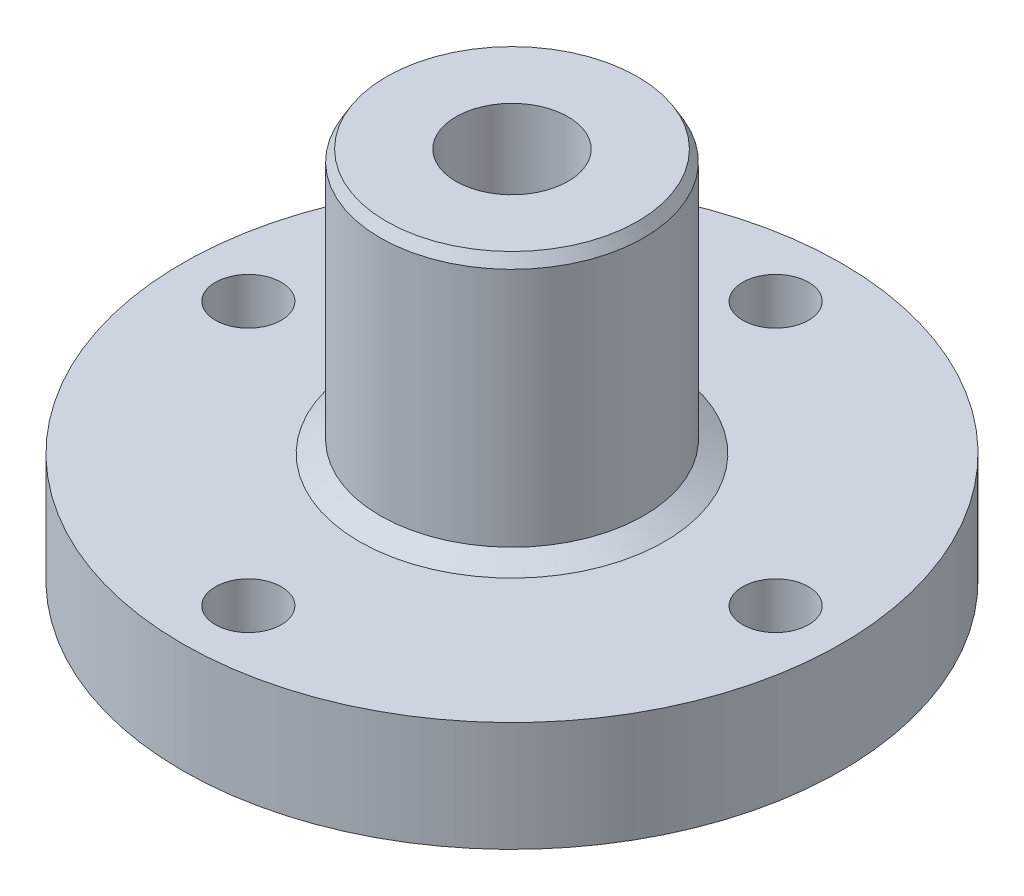
ISO-10303-21;
HEADER;
FILE_DESCRIPTION(('STEP AP214'),'2;1');
FILE_NAME('part.step','',(''),(''),'','','');
FILE_SCHEMA(('AUTOMOTIVE_DESIGN { 1 0 10303 214 1 1 1 1 }'));
ENDSEC;
DATA;
#1=APPLICATION_CONTEXT('core data for automotive mechanical design processes');
#2=APPLICATION_PROTOCOL_DEFINITION('international standard','automotive_design',2000,#1);
#3=PRODUCT_CONTEXT('',#1,'mechanical');
#4=PRODUCT('Part','Part','',(#3));
#5=PRODUCT_RELATED_PRODUCT_CATEGORY('part','',(#4));
#6=PRODUCT_DEFINITION_FORMATION('','',#4);
#7=PRODUCT_DEFINITION_CONTEXT('part definition',#1,'design');
#8=PRODUCT_DEFINITION('design','',#6,#7);
#9=PRODUCT_DEFINITION_SHAPE('','',#8);
#10=(LENGTH_UNIT() NAMED_UNIT(*) SI_UNIT(.MILLI.,.METRE.));
#11=(NAMED_UNIT(*) PLANE_ANGLE_UNIT() SI_UNIT($,.RADIAN.));
#12=(NAMED_UNIT(*) SI_UNIT($,.STERADIAN.) SOLID_ANGLE_UNIT());
#13=UNCERTAINTY_MEASURE_WITH_UNIT(LENGTH_MEASURE(1.E-05),#10,'distance_accuracy_value','');
#14=(GEOMETRIC_REPRESENTATION_CONTEXT(3) GLOBAL_UNCERTAINTY_ASSIGNED_CONTEXT((#13)) GLOBAL_UNIT_ASSIGNED_CONTEXT((#10,
#11,#12)) REPRESENTATION_CONTEXT('',''));
#15=CARTESIAN_POINT('',(0.,0.,0.));
#16=DIRECTION('',(0.,0.,1.));
#17=DIRECTION('',(1.,0.,0.));
#18=AXIS2_PLACEMENT_3D('',#15,#16,#17);
#19=CARTESIAN_POINT('',(0.,5.,0.));
#20=DIRECTION('',(0.,-1.,0.));
#21=DIRECTION('',(0.,0.,-1.));
#22=AXIS2_PLACEMENT_3D('',#19,#20,#21);
#23=CYLINDRICAL_SURFACE('',#22,15.);
#24=CARTESIAN_POINT('',(0.,5.,0.));
#25=DIRECTION('',(0.,1.,0.));
#26=DIRECTION('',(0.,0.,1.));
#27=AXIS2_PLACEMENT_3D('',#24,#25,#26);
#28=CIRCLE('',#27,15.);
#29=CARTESIAN_POINT('',(0.,5.,15.));
#30=VERTEX_POINT('',#29);
#31=EDGE_CURVE('E112',#30,#30,#28,.T.);
#32=ORIENTED_EDGE('',*,*,#31,.F.);
#33=EDGE_LOOP('',(#32));
#34=FACE_BOUND('',#33,.T.);
#35=CARTESIAN_POINT('',(0.,0.,0.));
#36=DIRECTION('',(0.,1.,0.));
#37=DIRECTION('',(0.,0.,1.));
#38=AXIS2_PLACEMENT_3D('',#35,#36,#37);
#39=CIRCLE('',#38,15.);
#40=CARTESIAN_POINT('',(0.,0.,15.));
#41=VERTEX_POINT('',#40);
#42=EDGE_CURVE('E110',#41,#41,#39,.T.);
#43=ORIENTED_EDGE('',*,*,#42,.T.);
#44=EDGE_LOOP('',(#43));
#45=FACE_BOUND('',#44,.T.);
#46=ADVANCED_FACE('F41',(#34,#45),#23,.T.);
#47=CARTESIAN_POINT('',(0.,5.,0.));
#48=DIRECTION('',(0.,1.,0.));
#49=DIRECTION('',(0.,0.,1.));
#50=AXIS2_PLACEMENT_3D('',#47,#48,#49);
#51=PLANE('',#50);
#52=CARTESIAN_POINT('',(0.,5.,-12.));
#53=DIRECTION('',(0.,1.,0.));
#54=DIRECTION('',(0.,0.,1.));
#55=AXIS2_PLACEMENT_3D('',#52,#53,#54);
#56=CIRCLE('',#55,1.5);
#57=CARTESIAN_POINT('',(0.,5.,-10.5));
#58=VERTEX_POINT('',#57);
#59=EDGE_CURVE('E209',#58,#58,#56,.T.);
#60=ORIENTED_EDGE('',*,*,#59,.F.);
#61=EDGE_LOOP('',(#60));
#62=FACE_BOUND('',#61,.T.);
#63=CARTESIAN_POINT('',(-12.,5.,0.));
#64=DIRECTION('',(0.,1.,0.));
#65=DIRECTION('',(0.,0.,1.));
#66=AXIS2_PLACEMENT_3D('',#63,#64,#65);
#67=CIRCLE('',#66,1.5);
#68=CARTESIAN_POINT('',(-12.,5.,1.5));
#69=VERTEX_POINT('',#68);
#70=EDGE_CURVE('E210',#69,#69,#67,.T.);
#71=ORIENTED_EDGE('',*,*,#70,.F.);
#72=EDGE_LOOP('',(#71));
#73=FACE_BOUND('',#72,.T.);
#74=CARTESIAN_POINT('',(12.,5.,0.));
#75=DIRECTION('',(0.,1.,0.));
#76=DIRECTION('',(0.,0.,1.));
#77=AXIS2_PLACEMENT_3D('',#74,#75,#76);
#78=CIRCLE('',#77,1.5);
#79=CARTESIAN_POINT('',(12.,5.,1.5));
#80=VERTEX_POINT('',#79);
#81=EDGE_CURVE('E219',#80,#80,#78,.T.);
#82=ORIENTED_EDGE('',*,*,#81,.F.);
#83=EDGE_LOOP('',(#82));
#84=FACE_BOUND('',#83,.T.);
#85=CARTESIAN_POINT('',(0.,5.,12.));
#86=DIRECTION('',(0.,1.,0.));
#87=DIRECTION('',(0.,0.,1.));
#88=AXIS2_PLACEMENT_3D('',#85,#86,#87);
#89=CIRCLE('',#88,1.5);
#90=CARTESIAN_POINT('',(0.,5.,13.5));
#91=VERTEX_POINT('',#90);
#92=EDGE_CURVE('E225',#91,#91,#89,.T.);
#93=ORIENTED_EDGE('',*,*,#92,.F.);
#94=EDGE_LOOP('',(#93));
#95=FACE_BOUND('',#94,.T.);
#96=CARTESIAN_POINT('',(0.,5.,0.));
#97=DIRECTION('',(0.,1.,0.));
#98=DIRECTION('',(0.,0.,1.));
#99=AXIS2_PLACEMENT_3D('',#96,#97,#98);
#100=CIRCLE('',#99,6.947);
#101=CARTESIAN_POINT('',(0.,5.,6.947));
#102=VERTEX_POINT('',#101);
#103=EDGE_CURVE('E129',#102,#102,#100,.F.);
#104=ORIENTED_EDGE('',*,*,#103,.T.);
#105=EDGE_LOOP('',(#104));
#106=FACE_BOUND('',#105,.T.);
#107=ORIENTED_EDGE('',*,*,#31,.T.);
#108=EDGE_LOOP('',(#107));
#109=FACE_BOUND('',#108,.T.);
#110=ADVANCED_FACE('F151',(#62,#73,#84,#95,#106,#109),#51,.T.);
#111=CARTESIAN_POINT('',(0.,0.,0.));
#112=DIRECTION('',(0.,1.,0.));
#113=DIRECTION('',(0.,0.,1.));
#114=AXIS2_PLACEMENT_3D('',#111,#112,#113);
#115=PLANE('',#114);
#116=CARTESIAN_POINT('',(0.,0.,-12.));
#117=DIRECTION('',(0.,1.,0.));
#118=DIRECTION('',(0.,0.,1.));
#119=AXIS2_PLACEMENT_3D('',#116,#117,#118);
#120=CIRCLE('',#119,1.5);
#121=CARTESIAN_POINT('',(0.,0.,-10.5));
#122=VERTEX_POINT('',#121);
#123=EDGE_CURVE('E96',#122,#122,#120,.T.);
#124=ORIENTED_EDGE('',*,*,#123,.T.);
#125=EDGE_LOOP('',(#124));
#126=FACE_BOUND('',#125,.T.);
#127=CARTESIAN_POINT('',(-12.,0.,0.));
#128=DIRECTION('',(0.,1.,0.));
#129=DIRECTION('',(0.,0.,1.));
#130=AXIS2_PLACEMENT_3D('',#127,#128,#129);
#131=CIRCLE('',#130,1.5);
#132=CARTESIAN_POINT('',(-12.,0.,1.5));
#133=VERTEX_POINT('',#132);
#134=EDGE_CURVE('E214',#133,#133,#131,.T.);
#135=ORIENTED_EDGE('',*,*,#134,.T.);
#136=EDGE_LOOP('',(#135));
#137=FACE_BOUND('',#136,.T.);
#138=CARTESIAN_POINT('',(12.,0.,0.));
#139=DIRECTION('',(0.,1.,0.));
#140=DIRECTION('',(0.,0.,1.));
#141=AXIS2_PLACEMENT_3D('',#138,#139,#140);
#142=CIRCLE('',#141,1.5);
#143=CARTESIAN_POINT('',(12.,0.,1.5));
#144=VERTEX_POINT('',#143);
#145=EDGE_CURVE('E222',#144,#144,#142,.T.);
#146=ORIENTED_EDGE('',*,*,#145,.T.);
#147=EDGE_LOOP('',(#146));
#148=FACE_BOUND('',#147,.T.);
#149=CARTESIAN_POINT('',(0.,0.,12.));
#150=DIRECTION('',(0.,1.,0.));
#151=DIRECTION('',(0.,0.,1.));
#152=AXIS2_PLACEMENT_3D('',#149,#150,#151);
#153=CIRCLE('',#152,1.5);
#154=CARTESIAN_POINT('',(0.,0.,13.5));
#155=VERTEX_POINT('',#154);
#156=EDGE_CURVE('E228',#155,#155,#153,.T.);
#157=ORIENTED_EDGE('',*,*,#156,.T.);
#158=EDGE_LOOP('',(#157));
#159=FACE_BOUND('',#158,.T.);
#160=CARTESIAN_POINT('',(0.,0.,0.));
#161=DIRECTION('',(0.,1.,0.));
#162=DIRECTION('',(0.,0.,1.));
#163=AXIS2_PLACEMENT_3D('',#160,#161,#162);
#164=CIRCLE('',#163,2.55);
#165=CARTESIAN_POINT('',(0.,0.,2.55));
#166=VERTEX_POINT('',#165);
#167=EDGE_CURVE('E104',#166,#166,#164,.T.);
#168=ORIENTED_EDGE('',*,*,#167,.T.);
#169=EDGE_LOOP('',(#168));
#170=FACE_BOUND('',#169,.T.);
#171=ORIENTED_EDGE('',*,*,#42,.F.);
#172=EDGE_LOOP('',(#171));
#173=FACE_BOUND('',#172,.T.);
#174=ADVANCED_FACE('F157',(#126,#137,#148,#159,#170,#173),#115,.F.);
#175=CARTESIAN_POINT('',(0.,17.,0.));
#176=DIRECTION('',(0.,-1.,0.));
#177=DIRECTION('',(0.,0.,-1.));
#178=AXIS2_PLACEMENT_3D('',#175,#176,#177);
#179=CYLINDRICAL_SURFACE('',#178,6.);
#180=CARTESIAN_POINT('',(0.,16.5,0.));
#181=DIRECTION('',(0.,1.,0.));
#182=DIRECTION('',(0.,0.,1.));
#183=AXIS2_PLACEMENT_3D('',#180,#181,#182);
#184=CIRCLE('',#183,6.);
#185=CARTESIAN_POINT('',(0.,16.5,6.));
#186=VERTEX_POINT('',#185);
#187=EDGE_CURVE('E11',#186,#186,#184,.F.);
#188=ORIENTED_EDGE('',*,*,#187,.T.);
#189=EDGE_LOOP('',(#188));
#190=FACE_BOUND('',#189,.T.);
#191=CARTESIAN_POINT('',(0.,5.54675070492258,0.));
#192=DIRECTION('',(0.,1.,0.));
#193=DIRECTION('',(0.,0.,1.));
#194=AXIS2_PLACEMENT_3D('',#191,#192,#193);
#195=CIRCLE('',#194,6.);
#196=CARTESIAN_POINT('',(0.,5.54675070492258,6.));
#197=VERTEX_POINT('',#196);
#198=EDGE_CURVE('E126',#197,#197,#195,.T.);
#199=ORIENTED_EDGE('',*,*,#198,.T.);
#200=EDGE_LOOP('',(#199));
#201=FACE_BOUND('',#200,.T.);
#202=CARTESIAN_POINT('',(0.,10.,0.));
#203=DIRECTION('',(0.,-1.,0.));
#204=DIRECTION('',(0.,0.,-1.));
#205=AXIS2_PLACEMENT_3D('',#202,#203,#204);
#206=CIRCLE('',#205,6.);
#207=CARTESIAN_POINT('',(-2.,10.,-5.65685424949238));
#208=VERTEX_POINT('',#207);
#209=CARTESIAN_POINT('',(2.,10.,-5.65685424949238));
#210=VERTEX_POINT('',#209);
#211=EDGE_CURVE('E100',#208,#210,#206,.T.);
#212=ORIENTED_EDGE('',*,*,#211,.T.);
#213=DIRECTION('',(0.,-1.,0.));
#214=VECTOR('',#213,1.);
#215=CARTESIAN_POINT('',(2.,17.,-5.65685424949238));
#216=LINE('',#215,#214);
#217=CARTESIAN_POINT('',(2.,13.,-5.65685424949238));
#218=VERTEX_POINT('',#217);
#219=EDGE_CURVE('E91',#210,#218,#216,.F.);
#220=ORIENTED_EDGE('',*,*,#219,.T.);
#221=CARTESIAN_POINT('',(0.,13.,0.));
#222=DIRECTION('',(0.,1.,0.));
#223=DIRECTION('',(0.,0.,1.));
#224=AXIS2_PLACEMENT_3D('',#221,#222,#223);
#225=CIRCLE('',#224,6.);
#226=CARTESIAN_POINT('',(-2.,13.,-5.65685424949238));
#227=VERTEX_POINT('',#226);
#228=EDGE_CURVE('E80',#218,#227,#225,.T.);
#229=ORIENTED_EDGE('',*,*,#228,.T.);
#230=DIRECTION('',(0.,-1.,0.));
#231=VECTOR('',#230,1.);
#232=CARTESIAN_POINT('',(-2.,17.,-5.65685424949238));
#233=LINE('',#232,#231);
#234=EDGE_CURVE('E85',#227,#208,#233,.T.);
#235=ORIENTED_EDGE('',*,*,#234,.T.);
#236=EDGE_LOOP('',(#212,#220,#229,#235));
#237=FACE_BOUND('',#236,.T.);
#238=ADVANCED_FACE('F99',(#190,#201,#237),#179,.T.);
#239=CARTESIAN_POINT('',(0.,17.,0.));
#240=DIRECTION('',(0.,1.,0.));
#241=DIRECTION('',(0.,0.,1.));
#242=AXIS2_PLACEMENT_3D('',#239,#240,#241);
#243=PLANE('',#242);
#244=CARTESIAN_POINT('',(0.,17.,0.));
#245=DIRECTION('',(0.,1.,0.));
#246=DIRECTION('',(0.,0.,1.));
#247=AXIS2_PLACEMENT_3D('',#244,#245,#246);
#248=CIRCLE('',#247,5.71132486540519);
#249=CARTESIAN_POINT('',(0.,17.,5.71132486540519));
#250=VERTEX_POINT('',#249);
#251=EDGE_CURVE('E50',#250,#250,#248,.T.);
#252=ORIENTED_EDGE('',*,*,#251,.T.);
#253=EDGE_LOOP('',(#252));
#254=FACE_BOUND('',#253,.T.);
#255=CARTESIAN_POINT('',(0.,17.,0.));
#256=DIRECTION('',(0.,1.,0.));
#257=DIRECTION('',(0.,0.,1.));
#258=AXIS2_PLACEMENT_3D('',#255,#256,#257);
#259=CIRCLE('',#258,2.55);
#260=CARTESIAN_POINT('',(0.,17.,2.55));
#261=VERTEX_POINT('',#260);
#262=EDGE_CURVE('E101',#261,#261,#259,.T.);
#263=ORIENTED_EDGE('',*,*,#262,.F.);
#264=EDGE_LOOP('',(#263));
#265=FACE_BOUND('',#264,.T.);
#266=ADVANCED_FACE('F134',(#254,#265),#243,.T.);
#267=CARTESIAN_POINT('',(0.,0.,0.));
#268=DIRECTION('',(0.,1.,0.));
#269=DIRECTION('',(0.,0.,1.));
#270=AXIS2_PLACEMENT_3D('',#267,#268,#269);
#271=CYLINDRICAL_SURFACE('',#270,2.55);
#272=CARTESIAN_POINT('',(0.,13.,0.));
#273=DIRECTION('',(0.,1.,0.));
#274=DIRECTION('',(0.,0.,1.));
#275=AXIS2_PLACEMENT_3D('',#272,#273,#274);
#276=CIRCLE('',#275,2.55);
#277=CARTESIAN_POINT('',(-2.,13.,-1.58192920195564));
#278=VERTEX_POINT('',#277);
#279=CARTESIAN_POINT('',(2.,13.,-1.58192920195564));
#280=VERTEX_POINT('',#279);
#281=EDGE_CURVE('E115',#278,#280,#276,.F.);
#282=ORIENTED_EDGE('',*,*,#281,.T.);
#283=DIRECTION('',(0.,1.,0.));
#284=VECTOR('',#283,1.);
#285=CARTESIAN_POINT('',(2.,0.,-1.58192920195563));
#286=LINE('',#285,#284);
#287=CARTESIAN_POINT('',(2.,10.,-1.58192920195564));
#288=VERTEX_POINT('',#287);
#289=EDGE_CURVE('E94',#280,#288,#286,.F.);
#290=ORIENTED_EDGE('',*,*,#289,.T.);
#291=CARTESIAN_POINT('',(0.,10.,0.));
#292=DIRECTION('',(0.,-1.,0.));
#293=DIRECTION('',(0.,0.,-1.));
#294=AXIS2_PLACEMENT_3D('',#291,#292,#293);
#295=CIRCLE('',#294,2.55);
#296=CARTESIAN_POINT('',(-2.,10.,-1.58192920195564));
#297=VERTEX_POINT('',#296);
#298=EDGE_CURVE('E122',#288,#297,#295,.F.);
#299=ORIENTED_EDGE('',*,*,#298,.T.);
#300=DIRECTION('',(0.,1.,0.));
#301=VECTOR('',#300,1.);
#302=CARTESIAN_POINT('',(-2.,0.,-1.58192920195564));
#303=LINE('',#302,#301);
#304=EDGE_CURVE('E119',#297,#278,#303,.T.);
#305=ORIENTED_EDGE('',*,*,#304,.T.);
#306=EDGE_LOOP('',(#282,#290,#299,#305));
#307=FACE_BOUND('',#306,.T.);
#308=ORIENTED_EDGE('',*,*,#167,.F.);
#309=EDGE_LOOP('',(#308));
#310=FACE_BOUND('',#309,.T.);
#311=ORIENTED_EDGE('',*,*,#262,.T.);
#312=EDGE_LOOP('',(#311));
#313=FACE_BOUND('',#312,.T.);
#314=ADVANCED_FACE('F176',(#307,#310,#313),#271,.F.);
#315=CARTESIAN_POINT('',(2.,10.,-15.));
#316=DIRECTION('',(1.,0.,0.));
#317=DIRECTION('',(0.,1.,0.));
#318=AXIS2_PLACEMENT_3D('',#315,#316,#317);
#319=PLANE('',#318);
#320=DIRECTION('',(0.,0.,1.));
#321=VECTOR('',#320,1.);
#322=CARTESIAN_POINT('',(2.,10.,-15.));
#323=LINE('',#322,#321);
#324=EDGE_CURVE('E86',#210,#288,#323,.T.);
#325=ORIENTED_EDGE('',*,*,#324,.T.);
#326=ORIENTED_EDGE('',*,*,#289,.F.);
#327=DIRECTION('',(0.,0.,1.));
#328=VECTOR('',#327,1.);
#329=CARTESIAN_POINT('',(2.,13.,-15.));
#330=LINE('',#329,#328);
#331=EDGE_CURVE('E62',#218,#280,#330,.T.);
#332=ORIENTED_EDGE('',*,*,#331,.F.);
#333=ORIENTED_EDGE('',*,*,#219,.F.);
#334=EDGE_LOOP('',(#325,#326,#332,#333));
#335=FACE_BOUND('',#334,.T.);
#336=ADVANCED_FACE('F90',(#335),#319,.F.);
#337=CARTESIAN_POINT('',(-2.,10.,-15.));
#338=DIRECTION('',(0.,-1.,0.));
#339=DIRECTION('',(0.,0.,-1.));
#340=AXIS2_PLACEMENT_3D('',#337,#338,#339);
#341=PLANE('',#340);
#342=DIRECTION('',(0.,0.,1.));
#343=VECTOR('',#342,1.);
#344=CARTESIAN_POINT('',(-2.,10.,-15.));
#345=LINE('',#344,#343);
#346=EDGE_CURVE('E232',#208,#297,#345,.T.);
#347=ORIENTED_EDGE('',*,*,#346,.T.);
#348=ORIENTED_EDGE('',*,*,#298,.F.);
#349=ORIENTED_EDGE('',*,*,#324,.F.);
#350=ORIENTED_EDGE('',*,*,#211,.F.);
#351=EDGE_LOOP('',(#347,#348,#349,#350));
#352=FACE_BOUND('',#351,.T.);
#353=ADVANCED_FACE('F182',(#352),#341,.F.);
#354=CARTESIAN_POINT('',(-2.,10.,-15.));
#355=DIRECTION('',(-1.,0.,0.));
#356=DIRECTION('',(0.,-1.,0.));
#357=AXIS2_PLACEMENT_3D('',#354,#355,#356);
#358=PLANE('',#357);
#359=DIRECTION('',(0.,0.,1.));
#360=VECTOR('',#359,1.);
#361=CARTESIAN_POINT('',(-2.,13.,-15.));
#362=LINE('',#361,#360);
#363=EDGE_CURVE('E57',#227,#278,#362,.T.);
#364=ORIENTED_EDGE('',*,*,#363,.T.);
#365=ORIENTED_EDGE('',*,*,#304,.F.);
#366=ORIENTED_EDGE('',*,*,#346,.F.);
#367=ORIENTED_EDGE('',*,*,#234,.F.);
#368=EDGE_LOOP('',(#364,#365,#366,#367));
#369=FACE_BOUND('',#368,.T.);
#370=ADVANCED_FACE('F185',(#369),#358,.F.);
#371=CARTESIAN_POINT('',(2.,13.,-15.));
#372=DIRECTION('',(0.,1.,0.));
#373=DIRECTION('',(0.,0.,1.));
#374=AXIS2_PLACEMENT_3D('',#371,#372,#373);
#375=PLANE('',#374);
#376=ORIENTED_EDGE('',*,*,#331,.T.);
#377=ORIENTED_EDGE('',*,*,#281,.F.);
#378=ORIENTED_EDGE('',*,*,#363,.F.);
#379=ORIENTED_EDGE('',*,*,#228,.F.);
#380=EDGE_LOOP('',(#376,#377,#378,#379));
#381=FACE_BOUND('',#380,.T.);
#382=ADVANCED_FACE('F81',(#381),#375,.F.);
#383=CARTESIAN_POINT('',(0.,5.54675070492258,0.));
#384=DIRECTION('',(0.,-1.,0.));
#385=DIRECTION('',(0.,0.,-1.));
#386=AXIS2_PLACEMENT_3D('',#383,#384,#385);
#387=CONICAL_SURFACE('',#386,6.,1.04719755119659);
#388=ORIENTED_EDGE('',*,*,#103,.F.);
#389=EDGE_LOOP('',(#388));
#390=FACE_BOUND('',#389,.T.);
#391=ORIENTED_EDGE('',*,*,#198,.F.);
#392=EDGE_LOOP('',(#391));
#393=FACE_BOUND('',#392,.T.);
#394=ADVANCED_FACE('F139',(#390,#393),#387,.T.);
#395=CARTESIAN_POINT('',(0.,17.,0.));
#396=DIRECTION('',(0.,-1.,0.));
#397=DIRECTION('',(0.,0.,-1.));
#398=AXIS2_PLACEMENT_3D('',#395,#396,#397);
#399=CONICAL_SURFACE('',#398,5.71132486540519,0.523598775598298);
#400=ORIENTED_EDGE('',*,*,#187,.F.);
#401=EDGE_LOOP('',(#400));
#402=FACE_BOUND('',#401,.T.);
#403=ORIENTED_EDGE('',*,*,#251,.F.);
#404=EDGE_LOOP('',(#403));
#405=FACE_BOUND('',#404,.T.);
#406=ADVANCED_FACE('F44',(#402,#405),#399,.T.);
#407=CARTESIAN_POINT('',(0.,0.,12.));
#408=DIRECTION('',(0.,1.,0.));
#409=DIRECTION('',(0.,0.,1.));
#410=AXIS2_PLACEMENT_3D('',#407,#408,#409);
#411=CYLINDRICAL_SURFACE('',#410,1.5);
#412=ORIENTED_EDGE('',*,*,#156,.F.);
#413=EDGE_LOOP('',(#412));
#414=FACE_BOUND('',#413,.T.);
#415=ORIENTED_EDGE('',*,*,#92,.T.);
#416=EDGE_LOOP('',(#415));
#417=FACE_BOUND('',#416,.T.);
#418=ADVANCED_FACE('F138',(#414,#417),#411,.F.);
#419=CARTESIAN_POINT('',(12.,0.,0.));
#420=DIRECTION('',(0.,1.,0.));
#421=DIRECTION('',(0.,0.,1.));
#422=AXIS2_PLACEMENT_3D('',#419,#420,#421);
#423=CYLINDRICAL_SURFACE('',#422,1.5);
#424=ORIENTED_EDGE('',*,*,#145,.F.);
#425=EDGE_LOOP('',(#424));
#426=FACE_BOUND('',#425,.T.);
#427=ORIENTED_EDGE('',*,*,#81,.T.);
#428=EDGE_LOOP('',(#427));
#429=FACE_BOUND('',#428,.T.);
#430=ADVANCED_FACE('F145',(#426,#429),#423,.F.);
#431=CARTESIAN_POINT('',(-12.,0.,0.));
#432=DIRECTION('',(0.,1.,0.));
#433=DIRECTION('',(0.,0.,1.));
#434=AXIS2_PLACEMENT_3D('',#431,#432,#433);
#435=CYLINDRICAL_SURFACE('',#434,1.5);
#436=ORIENTED_EDGE('',*,*,#134,.F.);
#437=EDGE_LOOP('',(#436));
#438=FACE_BOUND('',#437,.T.);
#439=ORIENTED_EDGE('',*,*,#70,.T.);
#440=EDGE_LOOP('',(#439));
#441=FACE_BOUND('',#440,.T.);
#442=ADVANCED_FACE('F194',(#438,#441),#435,.F.);
#443=CARTESIAN_POINT('',(0.,0.,-12.));
#444=DIRECTION('',(0.,1.,0.));
#445=DIRECTION('',(0.,0.,1.));
#446=AXIS2_PLACEMENT_3D('',#443,#444,#445);
#447=CYLINDRICAL_SURFACE('',#446,1.5);
#448=ORIENTED_EDGE('',*,*,#123,.F.);
#449=EDGE_LOOP('',(#448));
#450=FACE_BOUND('',#449,.T.);
#451=ORIENTED_EDGE('',*,*,#59,.T.);
#452=EDGE_LOOP('',(#451));
#453=FACE_BOUND('',#452,.T.);
#454=ADVANCED_FACE('F198',(#450,#453),#447,.F.);
#455=CLOSED_SHELL('',(#46,#110,#174,#238,#266,#314,#336,#353,#370,#382,#394,#406,#418,#430,#442,#454));
#456=MANIFOLD_SOLID_BREP('B2',#455);
#457=ADVANCED_BREP_SHAPE_REPRESENTATION('',(#18,#456),#14);
#458=SHAPE_DEFINITION_REPRESENTATION(#9,#457);
ENDSEC;
END-ISO-10303-21;
